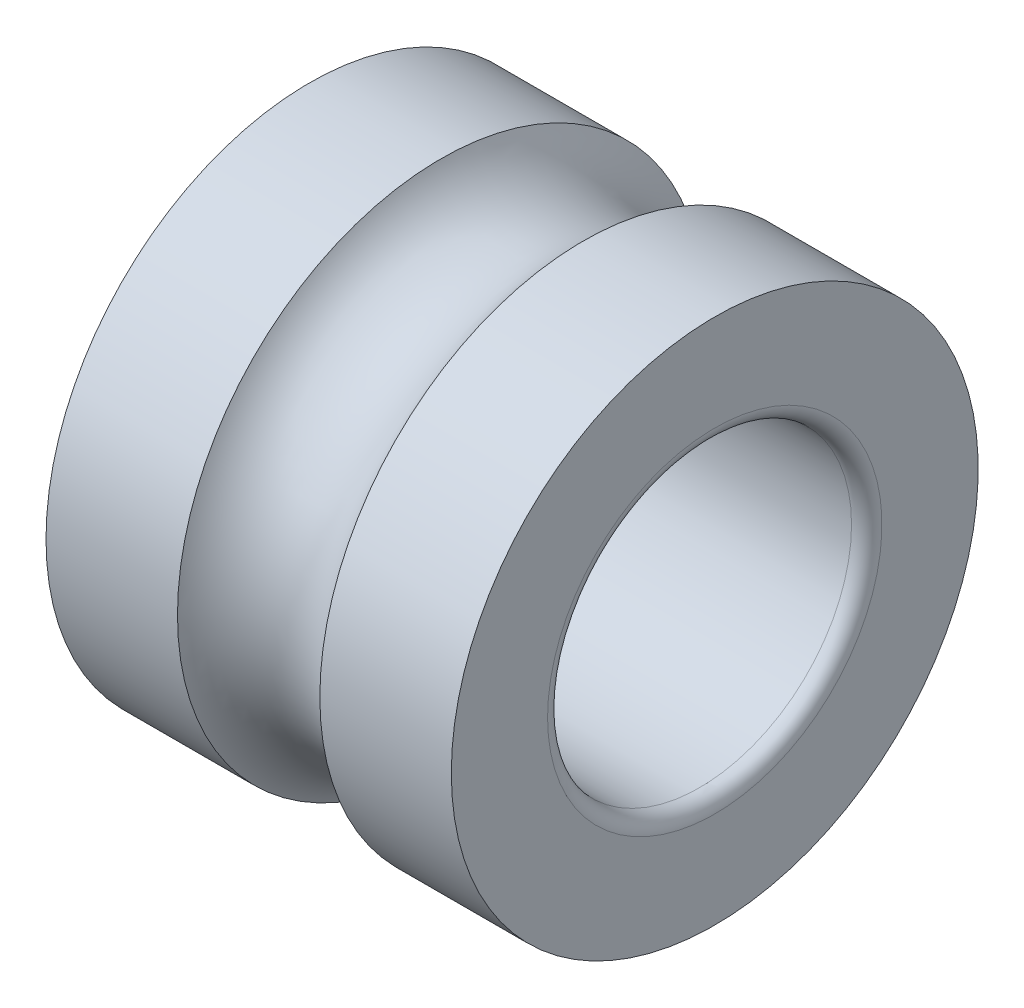
ISO-10303-21;
HEADER;
FILE_DESCRIPTION(('STEP AP214'),'2;1');
FILE_NAME('part.step','',(''),(''),'','','');
FILE_SCHEMA(('AUTOMOTIVE_DESIGN { 1 0 10303 214 1 1 1 1 }'));
ENDSEC;
DATA;
#1=APPLICATION_CONTEXT('core data for automotive mechanical design processes');
#2=APPLICATION_PROTOCOL_DEFINITION('international standard','automotive_design',2000,#1);
#3=PRODUCT_CONTEXT('',#1,'mechanical');
#4=PRODUCT('Part','Part','',(#3));
#5=PRODUCT_RELATED_PRODUCT_CATEGORY('part','',(#4));
#6=PRODUCT_DEFINITION_FORMATION('','',#4);
#7=PRODUCT_DEFINITION_CONTEXT('part definition',#1,'design');
#8=PRODUCT_DEFINITION('design','',#6,#7);
#9=PRODUCT_DEFINITION_SHAPE('','',#8);
#10=(LENGTH_UNIT() NAMED_UNIT(*) SI_UNIT(.MILLI.,.METRE.));
#11=(NAMED_UNIT(*) PLANE_ANGLE_UNIT() SI_UNIT($,.RADIAN.));
#12=(NAMED_UNIT(*) SI_UNIT($,.STERADIAN.) SOLID_ANGLE_UNIT());
#13=UNCERTAINTY_MEASURE_WITH_UNIT(LENGTH_MEASURE(1.E-05),#10,'distance_accuracy_value','');
#14=(GEOMETRIC_REPRESENTATION_CONTEXT(3) GLOBAL_UNCERTAINTY_ASSIGNED_CONTEXT((#13)) GLOBAL_UNIT_ASSIGNED_CONTEXT((#10,
#11,#12)) REPRESENTATION_CONTEXT('',''));
#15=CARTESIAN_POINT('',(0.,0.,0.));
#16=DIRECTION('',(0.,0.,1.));
#17=DIRECTION('',(1.,0.,0.));
#18=AXIS2_PLACEMENT_3D('',#15,#16,#17);
#19=CARTESIAN_POINT('',(0.14999999999997,0.,0.));
#20=DIRECTION('',(-1.,0.,0.));
#21=DIRECTION('',(0.,0.,1.));
#22=AXIS2_PLACEMENT_3D('',#19,#20,#21);
#23=TOROIDAL_SURFACE('',#22,1.64999999999997,0.14999999999997);
#24=CARTESIAN_POINT('',(0.149999999999997,0.,0.));
#25=DIRECTION('',(-1.,0.,0.));
#26=DIRECTION('',(0.,0.,1.));
#27=AXIS2_PLACEMENT_3D('',#24,#25,#26);
#28=CIRCLE('',#27,1.5);
#29=CARTESIAN_POINT('',(0.149999999999997,0.,1.5));
#30=VERTEX_POINT('',#29);
#31=EDGE_CURVE('E10',#30,#30,#28,.T.);
#32=ORIENTED_EDGE('',*,*,#31,.F.);
#33=EDGE_LOOP('',(#32));
#34=FACE_BOUND('',#33,.T.);
#35=CARTESIAN_POINT('',(0.,0.,0.));
#36=DIRECTION('',(-1.,0.,0.));
#37=DIRECTION('',(0.,0.,1.));
#38=AXIS2_PLACEMENT_3D('',#35,#36,#37);
#39=CIRCLE('',#38,1.65);
#40=CARTESIAN_POINT('',(0.,0.,1.65));
#41=VERTEX_POINT('',#40);
#42=EDGE_CURVE('E59',#41,#41,#39,.T.);
#43=ORIENTED_EDGE('',*,*,#42,.T.);
#44=EDGE_LOOP('',(#43));
#45=FACE_BOUND('',#44,.T.);
#46=ADVANCED_FACE('F31',(#34,#45),#23,.T.);
#47=CARTESIAN_POINT('',(50.,0.,0.));
#48=DIRECTION('',(-1.,0.,0.));
#49=DIRECTION('',(0.,0.,1.));
#50=AXIS2_PLACEMENT_3D('',#47,#48,#49);
#51=CYLINDRICAL_SURFACE('',#50,1.5);
#52=CARTESIAN_POINT('',(3.85,0.,0.));
#53=DIRECTION('',(-1.,0.,0.));
#54=DIRECTION('',(0.,0.,1.));
#55=AXIS2_PLACEMENT_3D('',#52,#53,#54);
#56=CIRCLE('',#55,1.5);
#57=CARTESIAN_POINT('',(3.85,0.,1.5));
#58=VERTEX_POINT('',#57);
#59=EDGE_CURVE('E37',#58,#58,#56,.T.);
#60=ORIENTED_EDGE('',*,*,#59,.F.);
#61=EDGE_LOOP('',(#60));
#62=FACE_BOUND('',#61,.T.);
#63=ORIENTED_EDGE('',*,*,#31,.T.);
#64=EDGE_LOOP('',(#63));
#65=FACE_BOUND('',#64,.T.);
#66=ADVANCED_FACE('F96',(#62,#65),#51,.F.);
#67=CARTESIAN_POINT('',(3.85000000000006,0.,0.));
#68=DIRECTION('',(-1.,0.,0.));
#69=DIRECTION('',(0.,0.,1.));
#70=AXIS2_PLACEMENT_3D('',#67,#68,#69);
#71=TOROIDAL_SURFACE('',#70,1.64999999999994,0.149999999999939);
#72=CARTESIAN_POINT('',(4.,0.,0.));
#73=DIRECTION('',(-1.,0.,0.));
#74=DIRECTION('',(0.,0.,1.));
#75=AXIS2_PLACEMENT_3D('',#72,#73,#74);
#76=CIRCLE('',#75,1.65);
#77=CARTESIAN_POINT('',(4.,0.,1.65));
#78=VERTEX_POINT('',#77);
#79=EDGE_CURVE('E41',#78,#78,#76,.T.);
#80=ORIENTED_EDGE('',*,*,#79,.F.);
#81=EDGE_LOOP('',(#80));
#82=FACE_BOUND('',#81,.T.);
#83=ORIENTED_EDGE('',*,*,#59,.T.);
#84=EDGE_LOOP('',(#83));
#85=FACE_BOUND('',#84,.T.);
#86=ADVANCED_FACE('F91',(#82,#85),#71,.T.);
#87=CARTESIAN_POINT('',(4.,1.65,0.));
#88=DIRECTION('',(-1.,0.,0.));
#89=DIRECTION('',(0.,0.,1.));
#90=AXIS2_PLACEMENT_3D('',#87,#88,#89);
#91=PLANE('',#90);
#92=CARTESIAN_POINT('',(4.,0.,0.));
#93=DIRECTION('',(-1.,0.,0.));
#94=DIRECTION('',(0.,0.,1.));
#95=AXIS2_PLACEMENT_3D('',#92,#93,#94);
#96=CIRCLE('',#95,2.6);
#97=CARTESIAN_POINT('',(4.,0.,2.6));
#98=VERTEX_POINT('',#97);
#99=EDGE_CURVE('E45',#98,#98,#96,.T.);
#100=ORIENTED_EDGE('',*,*,#99,.F.);
#101=EDGE_LOOP('',(#100));
#102=FACE_BOUND('',#101,.T.);
#103=ORIENTED_EDGE('',*,*,#79,.T.);
#104=EDGE_LOOP('',(#103));
#105=FACE_BOUND('',#104,.T.);
#106=ADVANCED_FACE('F85',(#102,#105),#91,.F.);
#107=CARTESIAN_POINT('',(50.,0.,0.));
#108=DIRECTION('',(-1.,0.,0.));
#109=DIRECTION('',(0.,0.,1.));
#110=AXIS2_PLACEMENT_3D('',#107,#108,#109);
#111=CYLINDRICAL_SURFACE('',#110,2.6);
#112=CARTESIAN_POINT('',(2.7025211740581,0.,0.));
#113=DIRECTION('',(-1.,0.,0.));
#114=DIRECTION('',(0.,0.,1.));
#115=AXIS2_PLACEMENT_3D('',#112,#113,#114);
#116=CIRCLE('',#115,2.6);
#117=CARTESIAN_POINT('',(2.7025211740581,0.,2.6));
#118=VERTEX_POINT('',#117);
#119=EDGE_CURVE('E50',#118,#118,#116,.T.);
#120=ORIENTED_EDGE('',*,*,#119,.F.);
#121=EDGE_LOOP('',(#120));
#122=FACE_BOUND('',#121,.T.);
#123=ORIENTED_EDGE('',*,*,#99,.T.);
#124=EDGE_LOOP('',(#123));
#125=FACE_BOUND('',#124,.T.);
#126=ADVANCED_FACE('F79',(#122,#125),#111,.T.);
#127=CARTESIAN_POINT('',(2.,0.,0.));
#128=DIRECTION('',(-1.,0.,0.));
#129=DIRECTION('',(0.,0.,1.));
#130=AXIS2_PLACEMENT_3D('',#127,#128,#129);
#131=TOROIDAL_SURFACE('',#130,2.96999999999997,0.793999999999966);
#132=CARTESIAN_POINT('',(1.2974788259419,0.,0.));
#133=DIRECTION('',(-1.,0.,0.));
#134=DIRECTION('',(0.,0.,1.));
#135=AXIS2_PLACEMENT_3D('',#132,#133,#134);
#136=CIRCLE('',#135,2.6);
#137=CARTESIAN_POINT('',(1.2974788259419,0.,2.6));
#138=VERTEX_POINT('',#137);
#139=EDGE_CURVE('E53',#138,#138,#136,.T.);
#140=ORIENTED_EDGE('',*,*,#139,.F.);
#141=EDGE_LOOP('',(#140));
#142=FACE_BOUND('',#141,.T.);
#143=ORIENTED_EDGE('',*,*,#119,.T.);
#144=EDGE_LOOP('',(#143));
#145=FACE_BOUND('',#144,.T.);
#146=ADVANCED_FACE('F73',(#142,#145),#131,.F.);
#147=CARTESIAN_POINT('',(50.,0.,0.));
#148=DIRECTION('',(-1.,0.,0.));
#149=DIRECTION('',(0.,0.,1.));
#150=AXIS2_PLACEMENT_3D('',#147,#148,#149);
#151=CYLINDRICAL_SURFACE('',#150,2.6);
#152=CARTESIAN_POINT('',(0.,0.,0.));
#153=DIRECTION('',(-1.,0.,0.));
#154=DIRECTION('',(0.,0.,1.));
#155=AXIS2_PLACEMENT_3D('',#152,#153,#154);
#156=CIRCLE('',#155,2.6);
#157=CARTESIAN_POINT('',(0.,0.,2.6));
#158=VERTEX_POINT('',#157);
#159=EDGE_CURVE('E56',#158,#158,#156,.T.);
#160=ORIENTED_EDGE('',*,*,#159,.F.);
#161=EDGE_LOOP('',(#160));
#162=FACE_BOUND('',#161,.T.);
#163=ORIENTED_EDGE('',*,*,#139,.T.);
#164=EDGE_LOOP('',(#163));
#165=FACE_BOUND('',#164,.T.);
#166=ADVANCED_FACE('F67',(#162,#165),#151,.T.);
#167=CARTESIAN_POINT('',(0.,2.6,0.));
#168=DIRECTION('',(1.,0.,0.));
#169=DIRECTION('',(0.,0.,-1.));
#170=AXIS2_PLACEMENT_3D('',#167,#168,#169);
#171=PLANE('',#170);
#172=ORIENTED_EDGE('',*,*,#42,.F.);
#173=EDGE_LOOP('',(#172));
#174=FACE_BOUND('',#173,.T.);
#175=ORIENTED_EDGE('',*,*,#159,.T.);
#176=EDGE_LOOP('',(#175));
#177=FACE_BOUND('',#176,.T.);
#178=ADVANCED_FACE('F64',(#174,#177),#171,.F.);
#179=CLOSED_SHELL('',(#46,#66,#86,#106,#126,#146,#166,#178));
#180=MANIFOLD_SOLID_BREP('B2',#179);
#181=ADVANCED_BREP_SHAPE_REPRESENTATION('',(#18,#180),#14);
#182=SHAPE_DEFINITION_REPRESENTATION(#9,#181);
ENDSEC;
END-ISO-10303-21;
